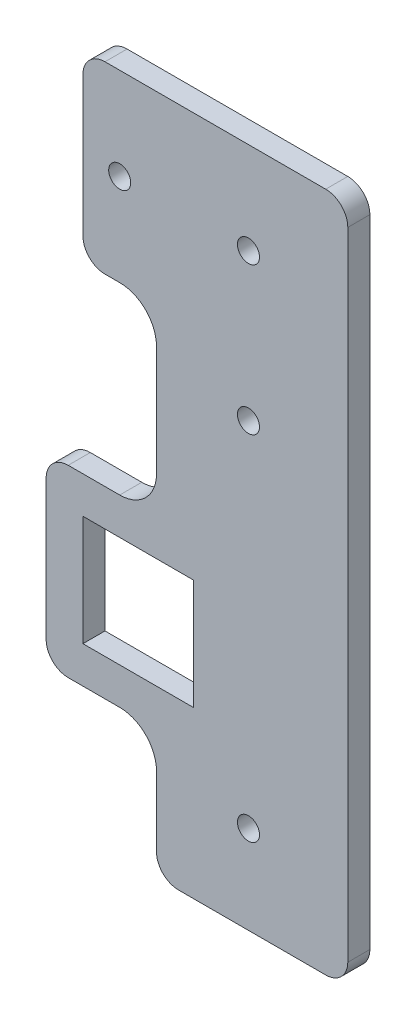
ISO-10303-21;
HEADER;
FILE_DESCRIPTION(('STEP AP214'),'2;1');
FILE_NAME('part.step','',(''),(''),'','','');
FILE_SCHEMA(('AUTOMOTIVE_DESIGN { 1 0 10303 214 1 1 1 1 }'));
ENDSEC;
DATA;
#1=APPLICATION_CONTEXT('core data for automotive mechanical design processes');
#2=APPLICATION_PROTOCOL_DEFINITION('international standard','automotive_design',2000,#1);
#3=PRODUCT_CONTEXT('',#1,'mechanical');
#4=PRODUCT('Part','Part','',(#3));
#5=PRODUCT_RELATED_PRODUCT_CATEGORY('part','',(#4));
#6=PRODUCT_DEFINITION_FORMATION('','',#4);
#7=PRODUCT_DEFINITION_CONTEXT('part definition',#1,'design');
#8=PRODUCT_DEFINITION('design','',#6,#7);
#9=PRODUCT_DEFINITION_SHAPE('','',#8);
#10=(LENGTH_UNIT() NAMED_UNIT(*) SI_UNIT(.MILLI.,.METRE.));
#11=(NAMED_UNIT(*) PLANE_ANGLE_UNIT() SI_UNIT($,.RADIAN.));
#12=(NAMED_UNIT(*) SI_UNIT($,.STERADIAN.) SOLID_ANGLE_UNIT());
#13=UNCERTAINTY_MEASURE_WITH_UNIT(LENGTH_MEASURE(1.E-05),#10,'distance_accuracy_value','');
#14=(GEOMETRIC_REPRESENTATION_CONTEXT(3) GLOBAL_UNCERTAINTY_ASSIGNED_CONTEXT((#13)) GLOBAL_UNIT_ASSIGNED_CONTEXT((#10,
#11,#12)) REPRESENTATION_CONTEXT('',''));
#15=CARTESIAN_POINT('',(0.,0.,0.));
#16=DIRECTION('',(0.,0.,1.));
#17=DIRECTION('',(1.,0.,0.));
#18=AXIS2_PLACEMENT_3D('',#15,#16,#17);
#19=CARTESIAN_POINT('',(0.,0.,3.));
#20=DIRECTION('',(0.,0.,1.));
#21=DIRECTION('',(1.,0.,0.));
#22=AXIS2_PLACEMENT_3D('',#19,#20,#21);
#23=PLANE('',#22);
#24=CARTESIAN_POINT('',(-17.5,0.,3.));
#25=DIRECTION('',(0.,0.,1.));
#26=DIRECTION('',(1.,0.,0.));
#27=AXIS2_PLACEMENT_3D('',#24,#25,#26);
#28=CIRCLE('',#27,1.5);
#29=CARTESIAN_POINT('',(-16.,0.,3.));
#30=VERTEX_POINT('',#29);
#31=EDGE_CURVE('E746',#30,#30,#28,.T.);
#32=ORIENTED_EDGE('',*,*,#31,.F.);
#33=EDGE_LOOP('',(#32));
#34=FACE_BOUND('',#33,.T.);
#35=CARTESIAN_POINT('',(0.,-20.,3.));
#36=DIRECTION('',(0.,0.,1.));
#37=DIRECTION('',(1.,0.,0.));
#38=AXIS2_PLACEMENT_3D('',#35,#36,#37);
#39=CIRCLE('',#38,1.5);
#40=CARTESIAN_POINT('',(1.5,-20.,3.));
#41=VERTEX_POINT('',#40);
#42=EDGE_CURVE('E232',#41,#41,#39,.T.);
#43=ORIENTED_EDGE('',*,*,#42,.F.);
#44=EDGE_LOOP('',(#43));
#45=FACE_BOUND('',#44,.T.);
#46=DIRECTION('',(1.,0.,0.));
#47=VECTOR('',#46,1.);
#48=CARTESIAN_POINT('',(-12.5,-80.,3.));
#49=LINE('',#48,#47);
#50=CARTESIAN_POINT('',(-9.49999999999999,-80.,3.));
#51=VERTEX_POINT('',#50);
#52=CARTESIAN_POINT('',(10.5,-80.,3.));
#53=VERTEX_POINT('',#52);
#54=EDGE_CURVE('E264',#51,#53,#49,.T.);
#55=ORIENTED_EDGE('',*,*,#54,.T.);
#56=CARTESIAN_POINT('',(10.5,-77.,3.));
#57=DIRECTION('',(0.,0.,1.));
#58=DIRECTION('',(1.,0.,0.));
#59=AXIS2_PLACEMENT_3D('',#56,#57,#58);
#60=CIRCLE('',#59,3.);
#61=CARTESIAN_POINT('',(13.5,-77.,3.));
#62=VERTEX_POINT('',#61);
#63=EDGE_CURVE('E361',#53,#62,#60,.T.);
#64=ORIENTED_EDGE('',*,*,#63,.T.);
#65=DIRECTION('',(0.,1.,0.));
#66=VECTOR('',#65,1.);
#67=CARTESIAN_POINT('',(13.5,-80.,3.));
#68=LINE('',#67,#66);
#69=CARTESIAN_POINT('',(13.5,9.49999999999999,3.));
#70=VERTEX_POINT('',#69);
#71=EDGE_CURVE('E267',#62,#70,#68,.T.);
#72=ORIENTED_EDGE('',*,*,#71,.T.);
#73=CARTESIAN_POINT('',(10.5,9.5,3.));
#74=DIRECTION('',(0.,0.,1.));
#75=DIRECTION('',(1.,0.,0.));
#76=AXIS2_PLACEMENT_3D('',#73,#74,#75);
#77=CIRCLE('',#76,3.);
#78=CARTESIAN_POINT('',(10.5,12.5,3.));
#79=VERTEX_POINT('',#78);
#80=EDGE_CURVE('E350',#70,#79,#77,.T.);
#81=ORIENTED_EDGE('',*,*,#80,.T.);
#82=DIRECTION('',(-1.,0.,0.));
#83=VECTOR('',#82,1.);
#84=CARTESIAN_POINT('',(13.5,12.5,3.));
#85=LINE('',#84,#83);
#86=CARTESIAN_POINT('',(-19.5,12.5,3.));
#87=VERTEX_POINT('',#86);
#88=EDGE_CURVE('E243',#79,#87,#85,.T.);
#89=ORIENTED_EDGE('',*,*,#88,.T.);
#90=CARTESIAN_POINT('',(-19.5,9.5,3.));
#91=DIRECTION('',(0.,0.,1.));
#92=DIRECTION('',(1.,0.,0.));
#93=AXIS2_PLACEMENT_3D('',#90,#91,#92);
#94=CIRCLE('',#93,3.);
#95=CARTESIAN_POINT('',(-22.5,9.5,3.));
#96=VERTEX_POINT('',#95);
#97=EDGE_CURVE('E352',#87,#96,#94,.T.);
#98=ORIENTED_EDGE('',*,*,#97,.T.);
#99=DIRECTION('',(0.,-1.,0.));
#100=VECTOR('',#99,1.);
#101=CARTESIAN_POINT('',(-22.5,12.5,3.));
#102=LINE('',#101,#100);
#103=CARTESIAN_POINT('',(-22.5,-9.5,3.));
#104=VERTEX_POINT('',#103);
#105=EDGE_CURVE('E246',#96,#104,#102,.T.);
#106=ORIENTED_EDGE('',*,*,#105,.T.);
#107=CARTESIAN_POINT('',(-19.5,-9.5,3.));
#108=DIRECTION('',(0.,0.,1.));
#109=DIRECTION('',(1.,0.,0.));
#110=AXIS2_PLACEMENT_3D('',#107,#108,#109);
#111=CIRCLE('',#110,3.);
#112=CARTESIAN_POINT('',(-19.5,-12.5,3.));
#113=VERTEX_POINT('',#112);
#114=EDGE_CURVE('E354',#104,#113,#111,.T.);
#115=ORIENTED_EDGE('',*,*,#114,.T.);
#116=DIRECTION('',(1.,0.,0.));
#117=VECTOR('',#116,1.);
#118=CARTESIAN_POINT('',(-22.5,-12.5,3.));
#119=LINE('',#118,#117);
#120=CARTESIAN_POINT('',(-17.5,-12.5,3.));
#121=VERTEX_POINT('',#120);
#122=EDGE_CURVE('E250',#113,#121,#119,.T.);
#123=ORIENTED_EDGE('',*,*,#122,.T.);
#124=CARTESIAN_POINT('',(-17.5,-17.5,3.));
#125=DIRECTION('',(0.,0.,1.));
#126=DIRECTION('',(1.,0.,0.));
#127=AXIS2_PLACEMENT_3D('',#124,#125,#126);
#128=CIRCLE('',#127,5.);
#129=CARTESIAN_POINT('',(-12.5,-17.5,3.));
#130=VERTEX_POINT('',#129);
#131=EDGE_CURVE('E320',#121,#130,#128,.F.);
#132=ORIENTED_EDGE('',*,*,#131,.T.);
#133=DIRECTION('',(0.,-1.,0.));
#134=VECTOR('',#133,1.);
#135=CARTESIAN_POINT('',(-12.5,-12.5,3.));
#136=LINE('',#135,#134);
#137=CARTESIAN_POINT('',(-12.5,-32.5,3.));
#138=VERTEX_POINT('',#137);
#139=EDGE_CURVE('E252',#130,#138,#136,.T.);
#140=ORIENTED_EDGE('',*,*,#139,.T.);
#141=CARTESIAN_POINT('',(-17.5,-32.5,3.));
#142=DIRECTION('',(0.,0.,1.));
#143=DIRECTION('',(1.,0.,0.));
#144=AXIS2_PLACEMENT_3D('',#141,#142,#143);
#145=CIRCLE('',#144,5.);
#146=CARTESIAN_POINT('',(-17.5,-37.5,3.));
#147=VERTEX_POINT('',#146);
#148=EDGE_CURVE('E324',#138,#147,#145,.F.);
#149=ORIENTED_EDGE('',*,*,#148,.T.);
#150=DIRECTION('',(-1.,0.,0.));
#151=VECTOR('',#150,1.);
#152=CARTESIAN_POINT('',(-12.5,-37.5,3.));
#153=LINE('',#152,#151);
#154=CARTESIAN_POINT('',(-24.5,-37.5,3.));
#155=VERTEX_POINT('',#154);
#156=EDGE_CURVE('E255',#147,#155,#153,.T.);
#157=ORIENTED_EDGE('',*,*,#156,.T.);
#158=CARTESIAN_POINT('',(-24.5,-40.5,3.));
#159=DIRECTION('',(0.,0.,1.));
#160=DIRECTION('',(1.,0.,0.));
#161=AXIS2_PLACEMENT_3D('',#158,#159,#160);
#162=CIRCLE('',#161,3.);
#163=CARTESIAN_POINT('',(-27.5,-40.5,3.));
#164=VERTEX_POINT('',#163);
#165=EDGE_CURVE('E356',#155,#164,#162,.T.);
#166=ORIENTED_EDGE('',*,*,#165,.T.);
#167=DIRECTION('',(0.,-1.,0.));
#168=VECTOR('',#167,1.);
#169=CARTESIAN_POINT('',(-27.5,-37.5,3.));
#170=LINE('',#169,#168);
#171=CARTESIAN_POINT('',(-27.5,-59.5,3.));
#172=VERTEX_POINT('',#171);
#173=EDGE_CURVE('E258',#164,#172,#170,.T.);
#174=ORIENTED_EDGE('',*,*,#173,.T.);
#175=CARTESIAN_POINT('',(-24.5,-59.5,3.));
#176=DIRECTION('',(0.,0.,1.));
#177=DIRECTION('',(1.,0.,0.));
#178=AXIS2_PLACEMENT_3D('',#175,#176,#177);
#179=CIRCLE('',#178,3.);
#180=CARTESIAN_POINT('',(-24.5,-62.5,3.));
#181=VERTEX_POINT('',#180);
#182=EDGE_CURVE('E58',#172,#181,#179,.T.);
#183=ORIENTED_EDGE('',*,*,#182,.T.);
#184=DIRECTION('',(1.,0.,0.));
#185=VECTOR('',#184,1.);
#186=CARTESIAN_POINT('',(-27.5,-62.5,3.));
#187=LINE('',#186,#185);
#188=CARTESIAN_POINT('',(-17.5,-62.5,3.));
#189=VERTEX_POINT('',#188);
#190=EDGE_CURVE('E260',#181,#189,#187,.T.);
#191=ORIENTED_EDGE('',*,*,#190,.T.);
#192=CARTESIAN_POINT('',(-17.5,-67.5,3.));
#193=DIRECTION('',(0.,0.,1.));
#194=DIRECTION('',(1.,0.,0.));
#195=AXIS2_PLACEMENT_3D('',#192,#193,#194);
#196=CIRCLE('',#195,5.);
#197=CARTESIAN_POINT('',(-12.5,-67.5,3.));
#198=VERTEX_POINT('',#197);
#199=EDGE_CURVE('E315',#189,#198,#196,.F.);
#200=ORIENTED_EDGE('',*,*,#199,.T.);
#201=DIRECTION('',(0.,-1.,0.));
#202=VECTOR('',#201,1.);
#203=CARTESIAN_POINT('',(-12.5,-62.5,3.));
#204=LINE('',#203,#202);
#205=CARTESIAN_POINT('',(-12.5,-77.,3.));
#206=VERTEX_POINT('',#205);
#207=EDGE_CURVE('E262',#198,#206,#204,.T.);
#208=ORIENTED_EDGE('',*,*,#207,.T.);
#209=CARTESIAN_POINT('',(-9.49999999999999,-77.,3.));
#210=DIRECTION('',(0.,0.,1.));
#211=DIRECTION('',(1.,0.,0.));
#212=AXIS2_PLACEMENT_3D('',#209,#210,#211);
#213=CIRCLE('',#212,3.);
#214=EDGE_CURVE('E359',#206,#51,#213,.T.);
#215=ORIENTED_EDGE('',*,*,#214,.T.);
#216=EDGE_LOOP('',(#55,#64,#72,#81,#89,#98,#106,#115,#123,#132,#140,#149,#157,#166,#174,#183,
#191,#200,#208,#215));
#217=FACE_BOUND('',#216,.T.);
#218=DIRECTION('',(-1.,0.,0.));
#219=VECTOR('',#218,1.);
#220=CARTESIAN_POINT('',(-7.5,-42.5,3.));
#221=LINE('',#220,#219);
#222=CARTESIAN_POINT('',(-7.5,-42.5,3.));
#223=VERTEX_POINT('',#222);
#224=CARTESIAN_POINT('',(-22.5,-42.5,3.));
#225=VERTEX_POINT('',#224);
#226=EDGE_CURVE('E209',#223,#225,#221,.T.);
#227=ORIENTED_EDGE('',*,*,#226,.F.);
#228=DIRECTION('',(0.,1.,0.));
#229=VECTOR('',#228,1.);
#230=CARTESIAN_POINT('',(-7.5,-42.5,3.));
#231=LINE('',#230,#229);
#232=CARTESIAN_POINT('',(-7.49999999999999,-57.5,3.));
#233=VERTEX_POINT('',#232);
#234=EDGE_CURVE('E199',#233,#223,#231,.T.);
#235=ORIENTED_EDGE('',*,*,#234,.F.);
#236=DIRECTION('',(1.,0.,0.));
#237=VECTOR('',#236,1.);
#238=CARTESIAN_POINT('',(-7.49999999999999,-57.5,3.));
#239=LINE('',#238,#237);
#240=CARTESIAN_POINT('',(-22.5,-57.5,3.));
#241=VERTEX_POINT('',#240);
#242=EDGE_CURVE('E225',#241,#233,#239,.T.);
#243=ORIENTED_EDGE('',*,*,#242,.F.);
#244=DIRECTION('',(0.,-1.,0.));
#245=VECTOR('',#244,1.);
#246=CARTESIAN_POINT('',(-22.5,-42.5,3.));
#247=LINE('',#246,#245);
#248=EDGE_CURVE('E223',#225,#241,#247,.T.);
#249=ORIENTED_EDGE('',*,*,#248,.F.);
#250=EDGE_LOOP('',(#227,#235,#243,#249));
#251=FACE_BOUND('',#250,.T.);
#252=CARTESIAN_POINT('',(0.,-68.,3.));
#253=DIRECTION('',(0.,0.,1.));
#254=DIRECTION('',(1.,0.,0.));
#255=AXIS2_PLACEMENT_3D('',#252,#253,#254);
#256=CIRCLE('',#255,1.5);
#257=CARTESIAN_POINT('',(1.50000000000001,-68.,3.));
#258=VERTEX_POINT('',#257);
#259=EDGE_CURVE('E750',#258,#258,#256,.T.);
#260=ORIENTED_EDGE('',*,*,#259,.F.);
#261=EDGE_LOOP('',(#260));
#262=FACE_BOUND('',#261,.T.);
#263=CARTESIAN_POINT('',(0.,0.,3.));
#264=DIRECTION('',(0.,0.,1.));
#265=DIRECTION('',(1.,0.,0.));
#266=AXIS2_PLACEMENT_3D('',#263,#264,#265);
#267=CIRCLE('',#266,1.5);
#268=CARTESIAN_POINT('',(1.5,0.,3.));
#269=VERTEX_POINT('',#268);
#270=EDGE_CURVE('E741',#269,#269,#267,.T.);
#271=ORIENTED_EDGE('',*,*,#270,.F.);
#272=EDGE_LOOP('',(#271));
#273=FACE_BOUND('',#272,.T.);
#274=ADVANCED_FACE('F35',(#34,#45,#217,#251,#262,#273),#23,.T.);
#275=CARTESIAN_POINT('',(0.,0.,0.));
#276=DIRECTION('',(0.,0.,1.));
#277=DIRECTION('',(1.,0.,0.));
#278=AXIS2_PLACEMENT_3D('',#275,#276,#277);
#279=PLANE('',#278);
#280=DIRECTION('',(0.,1.,0.));
#281=VECTOR('',#280,1.);
#282=CARTESIAN_POINT('',(13.5,-80.,0.));
#283=LINE('',#282,#281);
#284=CARTESIAN_POINT('',(13.5,-77.,0.));
#285=VERTEX_POINT('',#284);
#286=CARTESIAN_POINT('',(13.5,9.49999999999999,0.));
#287=VERTEX_POINT('',#286);
#288=EDGE_CURVE('E247',#285,#287,#283,.T.);
#289=ORIENTED_EDGE('',*,*,#288,.F.);
#290=CARTESIAN_POINT('',(10.5,-77.,0.));
#291=DIRECTION('',(0.,0.,1.));
#292=DIRECTION('',(1.,0.,0.));
#293=AXIS2_PLACEMENT_3D('',#290,#291,#292);
#294=CIRCLE('',#293,3.);
#295=CARTESIAN_POINT('',(10.5,-80.,0.));
#296=VERTEX_POINT('',#295);
#297=EDGE_CURVE('E343',#285,#296,#294,.F.);
#298=ORIENTED_EDGE('',*,*,#297,.T.);
#299=DIRECTION('',(1.,0.,0.));
#300=VECTOR('',#299,1.);
#301=CARTESIAN_POINT('',(-12.5,-80.,0.));
#302=LINE('',#301,#300);
#303=CARTESIAN_POINT('',(-9.49999999999999,-80.,0.));
#304=VERTEX_POINT('',#303);
#305=EDGE_CURVE('E291',#304,#296,#302,.T.);
#306=ORIENTED_EDGE('',*,*,#305,.F.);
#307=CARTESIAN_POINT('',(-9.49999999999999,-77.,0.));
#308=DIRECTION('',(0.,0.,1.));
#309=DIRECTION('',(1.,0.,0.));
#310=AXIS2_PLACEMENT_3D('',#307,#308,#309);
#311=CIRCLE('',#310,3.);
#312=CARTESIAN_POINT('',(-12.5,-77.,0.));
#313=VERTEX_POINT('',#312);
#314=EDGE_CURVE('E341',#304,#313,#311,.F.);
#315=ORIENTED_EDGE('',*,*,#314,.T.);
#316=DIRECTION('',(0.,-1.,0.));
#317=VECTOR('',#316,1.);
#318=CARTESIAN_POINT('',(-12.5,-62.5,0.));
#319=LINE('',#318,#317);
#320=CARTESIAN_POINT('',(-12.5,-67.5,0.));
#321=VERTEX_POINT('',#320);
#322=EDGE_CURVE('E289',#321,#313,#319,.T.);
#323=ORIENTED_EDGE('',*,*,#322,.F.);
#324=CARTESIAN_POINT('',(-17.5,-67.5,0.));
#325=DIRECTION('',(0.,0.,1.));
#326=DIRECTION('',(1.,0.,0.));
#327=AXIS2_PLACEMENT_3D('',#324,#325,#326);
#328=CIRCLE('',#327,5.);
#329=CARTESIAN_POINT('',(-17.5,-62.5,0.));
#330=VERTEX_POINT('',#329);
#331=EDGE_CURVE('E312',#321,#330,#328,.T.);
#332=ORIENTED_EDGE('',*,*,#331,.T.);
#333=DIRECTION('',(1.,0.,0.));
#334=VECTOR('',#333,1.);
#335=CARTESIAN_POINT('',(-27.5,-62.5,0.));
#336=LINE('',#335,#334);
#337=CARTESIAN_POINT('',(-24.5,-62.5,0.));
#338=VERTEX_POINT('',#337);
#339=EDGE_CURVE('E287',#338,#330,#336,.T.);
#340=ORIENTED_EDGE('',*,*,#339,.F.);
#341=CARTESIAN_POINT('',(-24.5,-59.5,0.));
#342=DIRECTION('',(0.,0.,1.));
#343=DIRECTION('',(1.,0.,0.));
#344=AXIS2_PLACEMENT_3D('',#341,#342,#343);
#345=CIRCLE('',#344,3.);
#346=CARTESIAN_POINT('',(-27.5,-59.5,0.));
#347=VERTEX_POINT('',#346);
#348=EDGE_CURVE('E339',#338,#347,#345,.F.);
#349=ORIENTED_EDGE('',*,*,#348,.T.);
#350=DIRECTION('',(0.,-1.,0.));
#351=VECTOR('',#350,1.);
#352=CARTESIAN_POINT('',(-27.5,-37.5,0.));
#353=LINE('',#352,#351);
#354=CARTESIAN_POINT('',(-27.5,-40.5,0.));
#355=VERTEX_POINT('',#354);
#356=EDGE_CURVE('E284',#355,#347,#353,.T.);
#357=ORIENTED_EDGE('',*,*,#356,.F.);
#358=CARTESIAN_POINT('',(-24.5,-40.5,0.));
#359=DIRECTION('',(0.,0.,1.));
#360=DIRECTION('',(1.,0.,0.));
#361=AXIS2_PLACEMENT_3D('',#358,#359,#360);
#362=CIRCLE('',#361,3.);
#363=CARTESIAN_POINT('',(-24.5,-37.5,0.));
#364=VERTEX_POINT('',#363);
#365=EDGE_CURVE('E337',#355,#364,#362,.F.);
#366=ORIENTED_EDGE('',*,*,#365,.T.);
#367=DIRECTION('',(-1.,0.,0.));
#368=VECTOR('',#367,1.);
#369=CARTESIAN_POINT('',(-12.5,-37.5,0.));
#370=LINE('',#369,#368);
#371=CARTESIAN_POINT('',(-17.5,-37.5,0.));
#372=VERTEX_POINT('',#371);
#373=EDGE_CURVE('E281',#372,#364,#370,.T.);
#374=ORIENTED_EDGE('',*,*,#373,.F.);
#375=CARTESIAN_POINT('',(-17.5,-32.5,0.));
#376=DIRECTION('',(0.,0.,1.));
#377=DIRECTION('',(1.,0.,0.));
#378=AXIS2_PLACEMENT_3D('',#375,#376,#377);
#379=CIRCLE('',#378,5.);
#380=CARTESIAN_POINT('',(-12.5,-32.5,0.));
#381=VERTEX_POINT('',#380);
#382=EDGE_CURVE('E322',#372,#381,#379,.T.);
#383=ORIENTED_EDGE('',*,*,#382,.T.);
#384=DIRECTION('',(0.,-1.,0.));
#385=VECTOR('',#384,1.);
#386=CARTESIAN_POINT('',(-12.5,-12.5,0.));
#387=LINE('',#386,#385);
#388=CARTESIAN_POINT('',(-12.5,-17.5,0.));
#389=VERTEX_POINT('',#388);
#390=EDGE_CURVE('E278',#389,#381,#387,.T.);
#391=ORIENTED_EDGE('',*,*,#390,.F.);
#392=CARTESIAN_POINT('',(-17.5,-17.5,0.));
#393=DIRECTION('',(0.,0.,1.));
#394=DIRECTION('',(1.,0.,0.));
#395=AXIS2_PLACEMENT_3D('',#392,#393,#394);
#396=CIRCLE('',#395,5.);
#397=CARTESIAN_POINT('',(-17.5,-12.5,0.));
#398=VERTEX_POINT('',#397);
#399=EDGE_CURVE('E317',#389,#398,#396,.T.);
#400=ORIENTED_EDGE('',*,*,#399,.T.);
#401=DIRECTION('',(1.,0.,0.));
#402=VECTOR('',#401,1.);
#403=CARTESIAN_POINT('',(-22.5,-12.5,0.));
#404=LINE('',#403,#402);
#405=CARTESIAN_POINT('',(-19.5,-12.5,0.));
#406=VERTEX_POINT('',#405);
#407=EDGE_CURVE('E276',#406,#398,#404,.T.);
#408=ORIENTED_EDGE('',*,*,#407,.F.);
#409=CARTESIAN_POINT('',(-19.5,-9.5,0.));
#410=DIRECTION('',(0.,0.,1.));
#411=DIRECTION('',(1.,0.,0.));
#412=AXIS2_PLACEMENT_3D('',#409,#410,#411);
#413=CIRCLE('',#412,3.);
#414=CARTESIAN_POINT('',(-22.5,-9.5,0.));
#415=VERTEX_POINT('',#414);
#416=EDGE_CURVE('E335',#406,#415,#413,.F.);
#417=ORIENTED_EDGE('',*,*,#416,.T.);
#418=DIRECTION('',(0.,-1.,0.));
#419=VECTOR('',#418,1.);
#420=CARTESIAN_POINT('',(-22.5,12.5,0.));
#421=LINE('',#420,#419);
#422=CARTESIAN_POINT('',(-22.5,9.5,0.));
#423=VERTEX_POINT('',#422);
#424=EDGE_CURVE('E273',#423,#415,#421,.T.);
#425=ORIENTED_EDGE('',*,*,#424,.F.);
#426=CARTESIAN_POINT('',(-19.5,9.5,0.));
#427=DIRECTION('',(0.,0.,1.));
#428=DIRECTION('',(1.,0.,0.));
#429=AXIS2_PLACEMENT_3D('',#426,#427,#428);
#430=CIRCLE('',#429,3.);
#431=CARTESIAN_POINT('',(-19.5,12.5,0.));
#432=VERTEX_POINT('',#431);
#433=EDGE_CURVE('E333',#423,#432,#430,.F.);
#434=ORIENTED_EDGE('',*,*,#433,.T.);
#435=DIRECTION('',(-1.,0.,0.));
#436=VECTOR('',#435,1.);
#437=CARTESIAN_POINT('',(13.5,12.5,0.));
#438=LINE('',#437,#436);
#439=CARTESIAN_POINT('',(10.5,12.5,0.));
#440=VERTEX_POINT('',#439);
#441=EDGE_CURVE('E217',#440,#432,#438,.T.);
#442=ORIENTED_EDGE('',*,*,#441,.F.);
#443=CARTESIAN_POINT('',(10.5,9.5,0.));
#444=DIRECTION('',(0.,0.,1.));
#445=DIRECTION('',(1.,0.,0.));
#446=AXIS2_PLACEMENT_3D('',#443,#444,#445);
#447=CIRCLE('',#446,3.);
#448=EDGE_CURVE('E331',#440,#287,#447,.F.);
#449=ORIENTED_EDGE('',*,*,#448,.T.);
#450=EDGE_LOOP('',(#289,#298,#306,#315,#323,#332,#340,#349,#357,#366,#374,#383,#391,#400,#408,
#417,#425,#434,#442,#449));
#451=FACE_BOUND('',#450,.T.);
#452=DIRECTION('',(0.,1.,0.));
#453=VECTOR('',#452,1.);
#454=CARTESIAN_POINT('',(-7.5,-42.5,0.));
#455=LINE('',#454,#453);
#456=CARTESIAN_POINT('',(-7.49999999999999,-57.5,0.));
#457=VERTEX_POINT('',#456);
#458=CARTESIAN_POINT('',(-7.5,-42.5,0.));
#459=VERTEX_POINT('',#458);
#460=EDGE_CURVE('E230',#457,#459,#455,.T.);
#461=ORIENTED_EDGE('',*,*,#460,.T.);
#462=DIRECTION('',(-1.,0.,0.));
#463=VECTOR('',#462,1.);
#464=CARTESIAN_POINT('',(-7.5,-42.5,0.));
#465=LINE('',#464,#463);
#466=CARTESIAN_POINT('',(-22.5,-42.5,0.));
#467=VERTEX_POINT('',#466);
#468=EDGE_CURVE('E216',#459,#467,#465,.T.);
#469=ORIENTED_EDGE('',*,*,#468,.T.);
#470=DIRECTION('',(0.,-1.,0.));
#471=VECTOR('',#470,1.);
#472=CARTESIAN_POINT('',(-22.5,-42.5,0.));
#473=LINE('',#472,#471);
#474=CARTESIAN_POINT('',(-22.5,-57.5,0.));
#475=VERTEX_POINT('',#474);
#476=EDGE_CURVE('E234',#467,#475,#473,.T.);
#477=ORIENTED_EDGE('',*,*,#476,.T.);
#478=DIRECTION('',(1.,0.,0.));
#479=VECTOR('',#478,1.);
#480=CARTESIAN_POINT('',(-7.49999999999999,-57.5,0.));
#481=LINE('',#480,#479);
#482=EDGE_CURVE('E210',#475,#457,#481,.T.);
#483=ORIENTED_EDGE('',*,*,#482,.T.);
#484=EDGE_LOOP('',(#461,#469,#477,#483));
#485=FACE_BOUND('',#484,.T.);
#486=CARTESIAN_POINT('',(0.,-20.,0.));
#487=DIRECTION('',(0.,0.,1.));
#488=DIRECTION('',(1.,0.,0.));
#489=AXIS2_PLACEMENT_3D('',#486,#487,#488);
#490=CIRCLE('',#489,1.5);
#491=CARTESIAN_POINT('',(1.5,-20.,0.));
#492=VERTEX_POINT('',#491);
#493=EDGE_CURVE('E728',#492,#492,#490,.T.);
#494=ORIENTED_EDGE('',*,*,#493,.T.);
#495=EDGE_LOOP('',(#494));
#496=FACE_BOUND('',#495,.T.);
#497=CARTESIAN_POINT('',(0.,-68.,0.));
#498=DIRECTION('',(0.,0.,1.));
#499=DIRECTION('',(1.,0.,0.));
#500=AXIS2_PLACEMENT_3D('',#497,#498,#499);
#501=CIRCLE('',#500,1.5);
#502=CARTESIAN_POINT('',(1.50000000000001,-68.,0.));
#503=VERTEX_POINT('',#502);
#504=EDGE_CURVE('E732',#503,#503,#501,.T.);
#505=ORIENTED_EDGE('',*,*,#504,.T.);
#506=EDGE_LOOP('',(#505));
#507=FACE_BOUND('',#506,.T.);
#508=CARTESIAN_POINT('',(-17.5,0.,0.));
#509=DIRECTION('',(0.,0.,1.));
#510=DIRECTION('',(1.,0.,0.));
#511=AXIS2_PLACEMENT_3D('',#508,#509,#510);
#512=CIRCLE('',#511,1.5);
#513=CARTESIAN_POINT('',(-16.,0.,0.));
#514=VERTEX_POINT('',#513);
#515=EDGE_CURVE('E736',#514,#514,#512,.T.);
#516=ORIENTED_EDGE('',*,*,#515,.T.);
#517=EDGE_LOOP('',(#516));
#518=FACE_BOUND('',#517,.T.);
#519=CARTESIAN_POINT('',(0.,0.,0.));
#520=DIRECTION('',(0.,0.,1.));
#521=DIRECTION('',(1.,0.,0.));
#522=AXIS2_PLACEMENT_3D('',#519,#520,#521);
#523=CIRCLE('',#522,1.5);
#524=CARTESIAN_POINT('',(1.5,0.,0.));
#525=VERTEX_POINT('',#524);
#526=EDGE_CURVE('E739',#525,#525,#523,.T.);
#527=ORIENTED_EDGE('',*,*,#526,.T.);
#528=EDGE_LOOP('',(#527));
#529=FACE_BOUND('',#528,.T.);
#530=ADVANCED_FACE('F392',(#451,#485,#496,#507,#518,#529),#279,.F.);
#531=CARTESIAN_POINT('',(13.5,12.5,3.));
#532=DIRECTION('',(0.,-1.,0.));
#533=DIRECTION('',(1.,0.,0.));
#534=AXIS2_PLACEMENT_3D('',#531,#532,#533);
#535=PLANE('',#534);
#536=ORIENTED_EDGE('',*,*,#441,.T.);
#537=DIRECTION('',(0.,0.,-1.));
#538=VECTOR('',#537,1.);
#539=CARTESIAN_POINT('',(-19.5,12.5,3.));
#540=LINE('',#539,#538);
#541=EDGE_CURVE('E11',#432,#87,#540,.F.);
#542=ORIENTED_EDGE('',*,*,#541,.T.);
#543=ORIENTED_EDGE('',*,*,#88,.F.);
#544=DIRECTION('',(0.,0.,-1.));
#545=VECTOR('',#544,1.);
#546=CARTESIAN_POINT('',(10.5,12.5,3.));
#547=LINE('',#546,#545);
#548=EDGE_CURVE('E43',#79,#440,#547,.T.);
#549=ORIENTED_EDGE('',*,*,#548,.T.);
#550=EDGE_LOOP('',(#536,#542,#543,#549));
#551=FACE_BOUND('',#550,.T.);
#552=ADVANCED_FACE('F386',(#551),#535,.F.);
#553=CARTESIAN_POINT('',(-22.5,12.5,3.));
#554=DIRECTION('',(1.,0.,0.));
#555=DIRECTION('',(0.,1.,0.));
#556=AXIS2_PLACEMENT_3D('',#553,#554,#555);
#557=PLANE('',#556);
#558=ORIENTED_EDGE('',*,*,#424,.T.);
#559=DIRECTION('',(0.,0.,-1.));
#560=VECTOR('',#559,1.);
#561=CARTESIAN_POINT('',(-22.5,-9.5,3.));
#562=LINE('',#561,#560);
#563=EDGE_CURVE('E380',#415,#104,#562,.F.);
#564=ORIENTED_EDGE('',*,*,#563,.T.);
#565=ORIENTED_EDGE('',*,*,#105,.F.);
#566=DIRECTION('',(0.,0.,-1.));
#567=VECTOR('',#566,1.);
#568=CARTESIAN_POINT('',(-22.5,9.5,3.));
#569=LINE('',#568,#567);
#570=EDGE_CURVE('E377',#96,#423,#569,.T.);
#571=ORIENTED_EDGE('',*,*,#570,.T.);
#572=EDGE_LOOP('',(#558,#564,#565,#571));
#573=FACE_BOUND('',#572,.T.);
#574=ADVANCED_FACE('F401',(#573),#557,.F.);
#575=CARTESIAN_POINT('',(-22.5,-12.5,3.));
#576=DIRECTION('',(0.,1.,0.));
#577=DIRECTION('',(0.,0.,1.));
#578=AXIS2_PLACEMENT_3D('',#575,#576,#577);
#579=PLANE('',#578);
#580=ORIENTED_EDGE('',*,*,#122,.F.);
#581=DIRECTION('',(0.,0.,-1.));
#582=VECTOR('',#581,1.);
#583=CARTESIAN_POINT('',(-19.5,-12.5,3.));
#584=LINE('',#583,#582);
#585=EDGE_CURVE('E374',#113,#406,#584,.T.);
#586=ORIENTED_EDGE('',*,*,#585,.T.);
#587=ORIENTED_EDGE('',*,*,#407,.T.);
#588=DIRECTION('',(0.,0.,-1.));
#589=VECTOR('',#588,1.);
#590=CARTESIAN_POINT('',(-17.5,-12.5,3.));
#591=LINE('',#590,#589);
#592=EDGE_CURVE('E306',#398,#121,#591,.F.);
#593=ORIENTED_EDGE('',*,*,#592,.T.);
#594=EDGE_LOOP('',(#580,#586,#587,#593));
#595=FACE_BOUND('',#594,.T.);
#596=ADVANCED_FACE('F410',(#595),#579,.F.);
#597=CARTESIAN_POINT('',(-12.5,-12.5,3.));
#598=DIRECTION('',(1.,0.,0.));
#599=DIRECTION('',(0.,1.,0.));
#600=AXIS2_PLACEMENT_3D('',#597,#598,#599);
#601=PLANE('',#600);
#602=ORIENTED_EDGE('',*,*,#139,.F.);
#603=DIRECTION('',(0.,0.,-1.));
#604=VECTOR('',#603,1.);
#605=CARTESIAN_POINT('',(-12.5,-17.5,0.));
#606=LINE('',#605,#604);
#607=EDGE_CURVE('E303',#130,#389,#606,.T.);
#608=ORIENTED_EDGE('',*,*,#607,.T.);
#609=ORIENTED_EDGE('',*,*,#390,.T.);
#610=DIRECTION('',(0.,0.,-1.));
#611=VECTOR('',#610,1.);
#612=CARTESIAN_POINT('',(-12.5,-32.5,3.));
#613=LINE('',#612,#611);
#614=EDGE_CURVE('E301',#381,#138,#613,.F.);
#615=ORIENTED_EDGE('',*,*,#614,.T.);
#616=EDGE_LOOP('',(#602,#608,#609,#615));
#617=FACE_BOUND('',#616,.T.);
#618=ADVANCED_FACE('F420',(#617),#601,.F.);
#619=CARTESIAN_POINT('',(-12.5,-37.5,3.));
#620=DIRECTION('',(0.,-1.,0.));
#621=DIRECTION('',(0.,0.,-1.));
#622=AXIS2_PLACEMENT_3D('',#619,#620,#621);
#623=PLANE('',#622);
#624=ORIENTED_EDGE('',*,*,#373,.T.);
#625=DIRECTION('',(0.,0.,-1.));
#626=VECTOR('',#625,1.);
#627=CARTESIAN_POINT('',(-24.5,-37.5,3.));
#628=LINE('',#627,#626);
#629=EDGE_CURVE('E372',#364,#155,#628,.F.);
#630=ORIENTED_EDGE('',*,*,#629,.T.);
#631=ORIENTED_EDGE('',*,*,#156,.F.);
#632=DIRECTION('',(0.,0.,-1.));
#633=VECTOR('',#632,1.);
#634=CARTESIAN_POINT('',(-17.5,-37.5,0.));
#635=LINE('',#634,#633);
#636=EDGE_CURVE('E309',#147,#372,#635,.T.);
#637=ORIENTED_EDGE('',*,*,#636,.T.);
#638=EDGE_LOOP('',(#624,#630,#631,#637));
#639=FACE_BOUND('',#638,.T.);
#640=ADVANCED_FACE('F428',(#639),#623,.F.);
#641=CARTESIAN_POINT('',(-27.5,-37.5,3.));
#642=DIRECTION('',(1.,0.,0.));
#643=DIRECTION('',(0.,1.,0.));
#644=AXIS2_PLACEMENT_3D('',#641,#642,#643);
#645=PLANE('',#644);
#646=ORIENTED_EDGE('',*,*,#356,.T.);
#647=DIRECTION('',(0.,0.,-1.));
#648=VECTOR('',#647,1.);
#649=CARTESIAN_POINT('',(-27.5,-59.5,3.));
#650=LINE('',#649,#648);
#651=EDGE_CURVE('E370',#347,#172,#650,.F.);
#652=ORIENTED_EDGE('',*,*,#651,.T.);
#653=ORIENTED_EDGE('',*,*,#173,.F.);
#654=DIRECTION('',(0.,0.,-1.));
#655=VECTOR('',#654,1.);
#656=CARTESIAN_POINT('',(-27.5,-40.5,3.));
#657=LINE('',#656,#655);
#658=EDGE_CURVE('E367',#164,#355,#657,.T.);
#659=ORIENTED_EDGE('',*,*,#658,.T.);
#660=EDGE_LOOP('',(#646,#652,#653,#659));
#661=FACE_BOUND('',#660,.T.);
#662=ADVANCED_FACE('F436',(#661),#645,.F.);
#663=CARTESIAN_POINT('',(-27.5,-62.5,3.));
#664=DIRECTION('',(0.,1.,0.));
#665=DIRECTION('',(-1.,0.,0.));
#666=AXIS2_PLACEMENT_3D('',#663,#664,#665);
#667=PLANE('',#666);
#668=ORIENTED_EDGE('',*,*,#190,.F.);
#669=DIRECTION('',(0.,0.,-1.));
#670=VECTOR('',#669,1.);
#671=CARTESIAN_POINT('',(-24.5,-62.5,3.));
#672=LINE('',#671,#670);
#673=EDGE_CURVE('E364',#181,#338,#672,.T.);
#674=ORIENTED_EDGE('',*,*,#673,.T.);
#675=ORIENTED_EDGE('',*,*,#339,.T.);
#676=DIRECTION('',(0.,0.,-1.));
#677=VECTOR('',#676,1.);
#678=CARTESIAN_POINT('',(-17.5,-62.5,3.));
#679=LINE('',#678,#677);
#680=EDGE_CURVE('E298',#330,#189,#679,.F.);
#681=ORIENTED_EDGE('',*,*,#680,.T.);
#682=EDGE_LOOP('',(#668,#674,#675,#681));
#683=FACE_BOUND('',#682,.T.);
#684=ADVANCED_FACE('F444',(#683),#667,.F.);
#685=CARTESIAN_POINT('',(-12.5,-62.5,3.));
#686=DIRECTION('',(1.,0.,0.));
#687=DIRECTION('',(0.,1.,0.));
#688=AXIS2_PLACEMENT_3D('',#685,#686,#687);
#689=PLANE('',#688);
#690=ORIENTED_EDGE('',*,*,#322,.T.);
#691=DIRECTION('',(0.,0.,-1.));
#692=VECTOR('',#691,1.);
#693=CARTESIAN_POINT('',(-12.5,-77.,3.));
#694=LINE('',#693,#692);
#695=EDGE_CURVE('E50',#313,#206,#694,.F.);
#696=ORIENTED_EDGE('',*,*,#695,.T.);
#697=ORIENTED_EDGE('',*,*,#207,.F.);
#698=DIRECTION('',(0.,0.,-1.));
#699=VECTOR('',#698,1.);
#700=CARTESIAN_POINT('',(-12.5,-67.5,0.));
#701=LINE('',#700,#699);
#702=EDGE_CURVE('E270',#198,#321,#701,.T.);
#703=ORIENTED_EDGE('',*,*,#702,.T.);
#704=EDGE_LOOP('',(#690,#696,#697,#703));
#705=FACE_BOUND('',#704,.T.);
#706=ADVANCED_FACE('F452',(#705),#689,.F.);
#707=CARTESIAN_POINT('',(-12.5,-80.,3.));
#708=DIRECTION('',(0.,1.,0.));
#709=DIRECTION('',(0.,0.,1.));
#710=AXIS2_PLACEMENT_3D('',#707,#708,#709);
#711=PLANE('',#710);
#712=ORIENTED_EDGE('',*,*,#305,.T.);
#713=DIRECTION('',(0.,0.,-1.));
#714=VECTOR('',#713,1.);
#715=CARTESIAN_POINT('',(10.5,-80.,3.));
#716=LINE('',#715,#714);
#717=EDGE_CURVE('E348',#296,#53,#716,.F.);
#718=ORIENTED_EDGE('',*,*,#717,.T.);
#719=ORIENTED_EDGE('',*,*,#54,.F.);
#720=DIRECTION('',(0.,0.,-1.));
#721=VECTOR('',#720,1.);
#722=CARTESIAN_POINT('',(-9.49999999999999,-80.,3.));
#723=LINE('',#722,#721);
#724=EDGE_CURVE('E345',#51,#304,#723,.T.);
#725=ORIENTED_EDGE('',*,*,#724,.T.);
#726=EDGE_LOOP('',(#712,#718,#719,#725));
#727=FACE_BOUND('',#726,.T.);
#728=ADVANCED_FACE('F459',(#727),#711,.F.);
#729=CARTESIAN_POINT('',(13.5,-80.,3.));
#730=DIRECTION('',(-1.,0.,0.));
#731=DIRECTION('',(0.,-1.,0.));
#732=AXIS2_PLACEMENT_3D('',#729,#730,#731);
#733=PLANE('',#732);
#734=ORIENTED_EDGE('',*,*,#71,.F.);
#735=DIRECTION('',(0.,0.,-1.));
#736=VECTOR('',#735,1.);
#737=CARTESIAN_POINT('',(13.5,-77.,3.));
#738=LINE('',#737,#736);
#739=EDGE_CURVE('E328',#62,#285,#738,.T.);
#740=ORIENTED_EDGE('',*,*,#739,.T.);
#741=ORIENTED_EDGE('',*,*,#288,.T.);
#742=DIRECTION('',(0.,0.,-1.));
#743=VECTOR('',#742,1.);
#744=CARTESIAN_POINT('',(13.5,9.49999999999999,3.));
#745=LINE('',#744,#743);
#746=EDGE_CURVE('E326',#287,#70,#745,.F.);
#747=ORIENTED_EDGE('',*,*,#746,.T.);
#748=EDGE_LOOP('',(#734,#740,#741,#747));
#749=FACE_BOUND('',#748,.T.);
#750=ADVANCED_FACE('F467',(#749),#733,.F.);
#751=CARTESIAN_POINT('',(-7.5,-42.5,3.));
#752=DIRECTION('',(-1.,0.,0.));
#753=DIRECTION('',(0.,-1.,0.));
#754=AXIS2_PLACEMENT_3D('',#751,#752,#753);
#755=PLANE('',#754);
#756=ORIENTED_EDGE('',*,*,#460,.F.);
#757=DIRECTION('',(0.,0.,-1.));
#758=VECTOR('',#757,1.);
#759=CARTESIAN_POINT('',(-7.49999999999999,-57.5,3.));
#760=LINE('',#759,#758);
#761=EDGE_CURVE('E205',#233,#457,#760,.T.);
#762=ORIENTED_EDGE('',*,*,#761,.F.);
#763=ORIENTED_EDGE('',*,*,#234,.T.);
#764=DIRECTION('',(0.,0.,-1.));
#765=VECTOR('',#764,1.);
#766=CARTESIAN_POINT('',(-7.5,-42.5,3.));
#767=LINE('',#766,#765);
#768=EDGE_CURVE('E202',#223,#459,#767,.T.);
#769=ORIENTED_EDGE('',*,*,#768,.T.);
#770=EDGE_LOOP('',(#756,#762,#763,#769));
#771=FACE_BOUND('',#770,.T.);
#772=ADVANCED_FACE('F201',(#771),#755,.T.);
#773=CARTESIAN_POINT('',(-7.5,-42.5,3.));
#774=DIRECTION('',(0.,-1.,0.));
#775=DIRECTION('',(1.,0.,0.));
#776=AXIS2_PLACEMENT_3D('',#773,#774,#775);
#777=PLANE('',#776);
#778=ORIENTED_EDGE('',*,*,#468,.F.);
#779=ORIENTED_EDGE('',*,*,#768,.F.);
#780=ORIENTED_EDGE('',*,*,#226,.T.);
#781=DIRECTION('',(0.,0.,-1.));
#782=VECTOR('',#781,1.);
#783=CARTESIAN_POINT('',(-22.5,-42.5,3.));
#784=LINE('',#783,#782);
#785=EDGE_CURVE('E218',#225,#467,#784,.T.);
#786=ORIENTED_EDGE('',*,*,#785,.T.);
#787=EDGE_LOOP('',(#778,#779,#780,#786));
#788=FACE_BOUND('',#787,.T.);
#789=ADVANCED_FACE('F213',(#788),#777,.T.);
#790=CARTESIAN_POINT('',(-22.5,-42.5,3.));
#791=DIRECTION('',(1.,0.,0.));
#792=DIRECTION('',(0.,1.,0.));
#793=AXIS2_PLACEMENT_3D('',#790,#791,#792);
#794=PLANE('',#793);
#795=ORIENTED_EDGE('',*,*,#476,.F.);
#796=ORIENTED_EDGE('',*,*,#785,.F.);
#797=ORIENTED_EDGE('',*,*,#248,.T.);
#798=DIRECTION('',(0.,0.,-1.));
#799=VECTOR('',#798,1.);
#800=CARTESIAN_POINT('',(-22.5,-57.5,3.));
#801=LINE('',#800,#799);
#802=EDGE_CURVE('E240',#241,#475,#801,.T.);
#803=ORIENTED_EDGE('',*,*,#802,.T.);
#804=EDGE_LOOP('',(#795,#796,#797,#803));
#805=FACE_BOUND('',#804,.T.);
#806=ADVANCED_FACE('F617',(#805),#794,.T.);
#807=CARTESIAN_POINT('',(-7.49999999999999,-57.5,3.));
#808=DIRECTION('',(0.,1.,0.));
#809=DIRECTION('',(0.,0.,1.));
#810=AXIS2_PLACEMENT_3D('',#807,#808,#809);
#811=PLANE('',#810);
#812=ORIENTED_EDGE('',*,*,#482,.F.);
#813=ORIENTED_EDGE('',*,*,#802,.F.);
#814=ORIENTED_EDGE('',*,*,#242,.T.);
#815=ORIENTED_EDGE('',*,*,#761,.T.);
#816=EDGE_LOOP('',(#812,#813,#814,#815));
#817=FACE_BOUND('',#816,.T.);
#818=ADVANCED_FACE('F608',(#817),#811,.T.);
#819=CARTESIAN_POINT('',(0.,-20.,3.));
#820=DIRECTION('',(0.,0.,-1.));
#821=DIRECTION('',(-1.,0.,0.));
#822=AXIS2_PLACEMENT_3D('',#819,#820,#821);
#823=CYLINDRICAL_SURFACE('',#822,1.5);
#824=ORIENTED_EDGE('',*,*,#42,.T.);
#825=EDGE_LOOP('',(#824));
#826=FACE_BOUND('',#825,.T.);
#827=ORIENTED_EDGE('',*,*,#493,.F.);
#828=EDGE_LOOP('',(#827));
#829=FACE_BOUND('',#828,.T.);
#830=ADVANCED_FACE('F599',(#826,#829),#823,.F.);
#831=CARTESIAN_POINT('',(0.,-68.,3.));
#832=DIRECTION('',(0.,0.,-1.));
#833=DIRECTION('',(-1.,0.,0.));
#834=AXIS2_PLACEMENT_3D('',#831,#832,#833);
#835=CYLINDRICAL_SURFACE('',#834,1.5);
#836=ORIENTED_EDGE('',*,*,#259,.T.);
#837=EDGE_LOOP('',(#836));
#838=FACE_BOUND('',#837,.T.);
#839=ORIENTED_EDGE('',*,*,#504,.F.);
#840=EDGE_LOOP('',(#839));
#841=FACE_BOUND('',#840,.T.);
#842=ADVANCED_FACE('F590',(#838,#841),#835,.F.);
#843=CARTESIAN_POINT('',(-17.5,0.,3.));
#844=DIRECTION('',(0.,0.,-1.));
#845=DIRECTION('',(-1.,0.,0.));
#846=AXIS2_PLACEMENT_3D('',#843,#844,#845);
#847=CYLINDRICAL_SURFACE('',#846,1.5);
#848=ORIENTED_EDGE('',*,*,#31,.T.);
#849=EDGE_LOOP('',(#848));
#850=FACE_BOUND('',#849,.T.);
#851=ORIENTED_EDGE('',*,*,#515,.F.);
#852=EDGE_LOOP('',(#851));
#853=FACE_BOUND('',#852,.T.);
#854=ADVANCED_FACE('F581',(#850,#853),#847,.F.);
#855=CARTESIAN_POINT('',(0.,0.,3.));
#856=DIRECTION('',(0.,0.,-1.));
#857=DIRECTION('',(-1.,0.,0.));
#858=AXIS2_PLACEMENT_3D('',#855,#856,#857);
#859=CYLINDRICAL_SURFACE('',#858,1.5);
#860=ORIENTED_EDGE('',*,*,#270,.T.);
#861=EDGE_LOOP('',(#860));
#862=FACE_BOUND('',#861,.T.);
#863=ORIENTED_EDGE('',*,*,#526,.F.);
#864=EDGE_LOOP('',(#863));
#865=FACE_BOUND('',#864,.T.);
#866=ADVANCED_FACE('F507',(#862,#865),#859,.F.);
#867=CARTESIAN_POINT('',(-17.5,-67.5,3.));
#868=DIRECTION('',(0.,0.,1.));
#869=DIRECTION('',(1.,0.,0.));
#870=AXIS2_PLACEMENT_3D('',#867,#868,#869);
#871=CYLINDRICAL_SURFACE('',#870,5.);
#872=ORIENTED_EDGE('',*,*,#199,.F.);
#873=ORIENTED_EDGE('',*,*,#680,.F.);
#874=ORIENTED_EDGE('',*,*,#331,.F.);
#875=ORIENTED_EDGE('',*,*,#702,.F.);
#876=EDGE_LOOP('',(#872,#873,#874,#875));
#877=FACE_BOUND('',#876,.T.);
#878=ADVANCED_FACE('F450',(#877),#871,.F.);
#879=CARTESIAN_POINT('',(-17.5,-17.5,3.));
#880=DIRECTION('',(0.,0.,1.));
#881=DIRECTION('',(1.,0.,0.));
#882=AXIS2_PLACEMENT_3D('',#879,#880,#881);
#883=CYLINDRICAL_SURFACE('',#882,5.);
#884=ORIENTED_EDGE('',*,*,#131,.F.);
#885=ORIENTED_EDGE('',*,*,#592,.F.);
#886=ORIENTED_EDGE('',*,*,#399,.F.);
#887=ORIENTED_EDGE('',*,*,#607,.F.);
#888=EDGE_LOOP('',(#884,#885,#886,#887));
#889=FACE_BOUND('',#888,.T.);
#890=ADVANCED_FACE('F416',(#889),#883,.F.);
#891=CARTESIAN_POINT('',(-17.5,-32.5,3.));
#892=DIRECTION('',(0.,0.,1.));
#893=DIRECTION('',(1.,0.,0.));
#894=AXIS2_PLACEMENT_3D('',#891,#892,#893);
#895=CYLINDRICAL_SURFACE('',#894,5.);
#896=ORIENTED_EDGE('',*,*,#148,.F.);
#897=ORIENTED_EDGE('',*,*,#614,.F.);
#898=ORIENTED_EDGE('',*,*,#382,.F.);
#899=ORIENTED_EDGE('',*,*,#636,.F.);
#900=EDGE_LOOP('',(#896,#897,#898,#899));
#901=FACE_BOUND('',#900,.T.);
#902=ADVANCED_FACE('F423',(#901),#895,.F.);
#903=CARTESIAN_POINT('',(10.5,-77.,3.));
#904=DIRECTION('',(0.,0.,-1.));
#905=DIRECTION('',(-1.,0.,0.));
#906=AXIS2_PLACEMENT_3D('',#903,#904,#905);
#907=CYLINDRICAL_SURFACE('',#906,3.);
#908=ORIENTED_EDGE('',*,*,#63,.F.);
#909=ORIENTED_EDGE('',*,*,#717,.F.);
#910=ORIENTED_EDGE('',*,*,#297,.F.);
#911=ORIENTED_EDGE('',*,*,#739,.F.);
#912=EDGE_LOOP('',(#908,#909,#910,#911));
#913=FACE_BOUND('',#912,.T.);
#914=ADVANCED_FACE('F463',(#913),#907,.T.);
#915=CARTESIAN_POINT('',(-9.49999999999999,-77.,3.));
#916=DIRECTION('',(0.,0.,-1.));
#917=DIRECTION('',(-1.,0.,0.));
#918=AXIS2_PLACEMENT_3D('',#915,#916,#917);
#919=CYLINDRICAL_SURFACE('',#918,3.);
#920=ORIENTED_EDGE('',*,*,#214,.F.);
#921=ORIENTED_EDGE('',*,*,#695,.F.);
#922=ORIENTED_EDGE('',*,*,#314,.F.);
#923=ORIENTED_EDGE('',*,*,#724,.F.);
#924=EDGE_LOOP('',(#920,#921,#922,#923));
#925=FACE_BOUND('',#924,.T.);
#926=ADVANCED_FACE('F454',(#925),#919,.T.);
#927=CARTESIAN_POINT('',(-24.5,-59.5,3.));
#928=DIRECTION('',(0.,0.,-1.));
#929=DIRECTION('',(-1.,0.,0.));
#930=AXIS2_PLACEMENT_3D('',#927,#928,#929);
#931=CYLINDRICAL_SURFACE('',#930,3.);
#932=ORIENTED_EDGE('',*,*,#182,.F.);
#933=ORIENTED_EDGE('',*,*,#651,.F.);
#934=ORIENTED_EDGE('',*,*,#348,.F.);
#935=ORIENTED_EDGE('',*,*,#673,.F.);
#936=EDGE_LOOP('',(#932,#933,#934,#935));
#937=FACE_BOUND('',#936,.T.);
#938=ADVANCED_FACE('F440',(#937),#931,.T.);
#939=CARTESIAN_POINT('',(-24.5,-40.5,3.));
#940=DIRECTION('',(0.,0.,-1.));
#941=DIRECTION('',(-1.,0.,0.));
#942=AXIS2_PLACEMENT_3D('',#939,#940,#941);
#943=CYLINDRICAL_SURFACE('',#942,3.);
#944=ORIENTED_EDGE('',*,*,#165,.F.);
#945=ORIENTED_EDGE('',*,*,#629,.F.);
#946=ORIENTED_EDGE('',*,*,#365,.F.);
#947=ORIENTED_EDGE('',*,*,#658,.F.);
#948=EDGE_LOOP('',(#944,#945,#946,#947));
#949=FACE_BOUND('',#948,.T.);
#950=ADVANCED_FACE('F432',(#949),#943,.T.);
#951=CARTESIAN_POINT('',(-19.5,-9.5,3.));
#952=DIRECTION('',(0.,0.,-1.));
#953=DIRECTION('',(-1.,0.,0.));
#954=AXIS2_PLACEMENT_3D('',#951,#952,#953);
#955=CYLINDRICAL_SURFACE('',#954,3.);
#956=ORIENTED_EDGE('',*,*,#114,.F.);
#957=ORIENTED_EDGE('',*,*,#563,.F.);
#958=ORIENTED_EDGE('',*,*,#416,.F.);
#959=ORIENTED_EDGE('',*,*,#585,.F.);
#960=EDGE_LOOP('',(#956,#957,#958,#959));
#961=FACE_BOUND('',#960,.T.);
#962=ADVANCED_FACE('F407',(#961),#955,.T.);
#963=CARTESIAN_POINT('',(-19.5,9.5,3.));
#964=DIRECTION('',(0.,0.,-1.));
#965=DIRECTION('',(-1.,0.,0.));
#966=AXIS2_PLACEMENT_3D('',#963,#964,#965);
#967=CYLINDRICAL_SURFACE('',#966,3.);
#968=ORIENTED_EDGE('',*,*,#97,.F.);
#969=ORIENTED_EDGE('',*,*,#541,.F.);
#970=ORIENTED_EDGE('',*,*,#433,.F.);
#971=ORIENTED_EDGE('',*,*,#570,.F.);
#972=EDGE_LOOP('',(#968,#969,#970,#971));
#973=FACE_BOUND('',#972,.T.);
#974=ADVANCED_FACE('F398',(#973),#967,.T.);
#975=CARTESIAN_POINT('',(10.5,9.5,3.));
#976=DIRECTION('',(0.,0.,-1.));
#977=DIRECTION('',(-1.,0.,0.));
#978=AXIS2_PLACEMENT_3D('',#975,#976,#977);
#979=CYLINDRICAL_SURFACE('',#978,3.);
#980=ORIENTED_EDGE('',*,*,#80,.F.);
#981=ORIENTED_EDGE('',*,*,#746,.F.);
#982=ORIENTED_EDGE('',*,*,#448,.F.);
#983=ORIENTED_EDGE('',*,*,#548,.F.);
#984=EDGE_LOOP('',(#980,#981,#982,#983));
#985=FACE_BOUND('',#984,.T.);
#986=ADVANCED_FACE('F37',(#985),#979,.T.);
#987=CLOSED_SHELL('',(#274,#530,#552,#574,#596,#618,#640,#662,#684,#706,#728,#750,#772,#789,
#806,#818,#830,#842,#854,#866,#878,#890,#902,#914,#926,#938,#950,#962,#974,#986));
#988=MANIFOLD_SOLID_BREP('B2',#987);
#989=ADVANCED_BREP_SHAPE_REPRESENTATION('',(#18,#988),#14);
#990=SHAPE_DEFINITION_REPRESENTATION(#9,#989);
ENDSEC;
END-ISO-10303-21;
